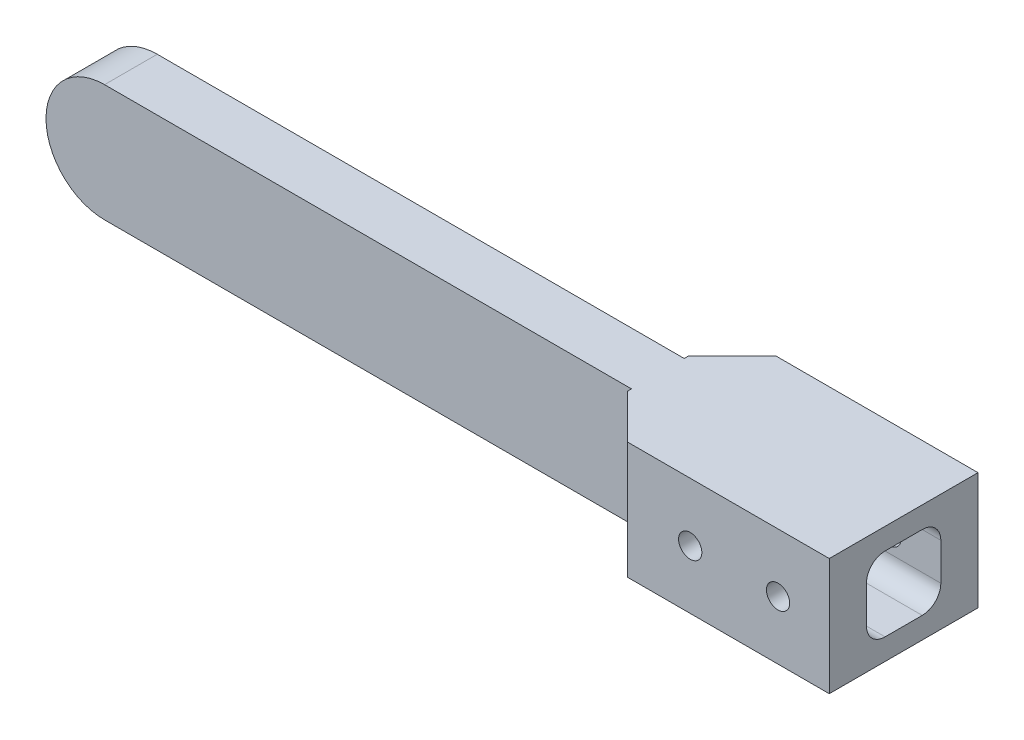
ISO-10303-21;
HEADER;
FILE_DESCRIPTION(('STEP AP214'),'2;1');
FILE_NAME('part.step','',(''),(''),'','','');
FILE_SCHEMA(('AUTOMOTIVE_DESIGN { 1 0 10303 214 1 1 1 1 }'));
ENDSEC;
DATA;
#1=APPLICATION_CONTEXT('core data for automotive mechanical design processes');
#2=APPLICATION_PROTOCOL_DEFINITION('international standard','automotive_design',2000,#1);
#3=PRODUCT_CONTEXT('',#1,'mechanical');
#4=PRODUCT('Part','Part','',(#3));
#5=PRODUCT_RELATED_PRODUCT_CATEGORY('part','',(#4));
#6=PRODUCT_DEFINITION_FORMATION('','',#4);
#7=PRODUCT_DEFINITION_CONTEXT('part definition',#1,'design');
#8=PRODUCT_DEFINITION('design','',#6,#7);
#9=PRODUCT_DEFINITION_SHAPE('','',#8);
#10=(LENGTH_UNIT() NAMED_UNIT(*) SI_UNIT(.MILLI.,.METRE.));
#11=(NAMED_UNIT(*) PLANE_ANGLE_UNIT() SI_UNIT($,.RADIAN.));
#12=(NAMED_UNIT(*) SI_UNIT($,.STERADIAN.) SOLID_ANGLE_UNIT());
#13=UNCERTAINTY_MEASURE_WITH_UNIT(LENGTH_MEASURE(1.E-05),#10,'distance_accuracy_value','');
#14=(GEOMETRIC_REPRESENTATION_CONTEXT(3) GLOBAL_UNCERTAINTY_ASSIGNED_CONTEXT((#13)) GLOBAL_UNIT_ASSIGNED_CONTEXT((#10,
#11,#12)) REPRESENTATION_CONTEXT('',''));
#15=CARTESIAN_POINT('',(0.,0.,0.));
#16=DIRECTION('',(0.,0.,1.));
#17=DIRECTION('',(1.,0.,0.));
#18=AXIS2_PLACEMENT_3D('',#15,#16,#17);
#19=CARTESIAN_POINT('',(20.,20.,0.));
#20=DIRECTION('',(0.,0.,1.));
#21=DIRECTION('',(1.,0.,0.));
#22=AXIS2_PLACEMENT_3D('',#19,#20,#21);
#23=CYLINDRICAL_SURFACE('',#22,20.);
#24=DIRECTION('',(0.,0.,1.));
#25=VECTOR('',#24,1.);
#26=CARTESIAN_POINT('',(20.,40.,0.));
#27=LINE('',#26,#25);
#28=CARTESIAN_POINT('',(20.,40.,0.));
#29=VERTEX_POINT('',#28);
#30=CARTESIAN_POINT('',(20.,40.,18.));
#31=VERTEX_POINT('',#30);
#32=EDGE_CURVE('E187',#29,#31,#27,.T.);
#33=ORIENTED_EDGE('',*,*,#32,.F.);
#34=CARTESIAN_POINT('',(20.,20.,0.));
#35=DIRECTION('',(0.,0.,1.));
#36=DIRECTION('',(1.,0.,0.));
#37=AXIS2_PLACEMENT_3D('',#34,#35,#36);
#38=CIRCLE('',#37,20.);
#39=CARTESIAN_POINT('',(20.,0.,0.));
#40=VERTEX_POINT('',#39);
#41=EDGE_CURVE('E198',#40,#29,#38,.F.);
#42=ORIENTED_EDGE('',*,*,#41,.F.);
#43=DIRECTION('',(0.,0.,-1.));
#44=VECTOR('',#43,1.);
#45=CARTESIAN_POINT('',(20.,0.,0.));
#46=LINE('',#45,#44);
#47=CARTESIAN_POINT('',(20.,0.,18.));
#48=VERTEX_POINT('',#47);
#49=EDGE_CURVE('E190',#48,#40,#46,.T.);
#50=ORIENTED_EDGE('',*,*,#49,.F.);
#51=CARTESIAN_POINT('',(20.,20.,18.));
#52=DIRECTION('',(0.,0.,-1.));
#53=DIRECTION('',(-1.,0.,0.));
#54=AXIS2_PLACEMENT_3D('',#51,#52,#53);
#55=CIRCLE('',#54,20.);
#56=EDGE_CURVE('E200',#31,#48,#55,.F.);
#57=ORIENTED_EDGE('',*,*,#56,.F.);
#58=EDGE_LOOP('',(#33,#42,#50,#57));
#59=FACE_BOUND('',#58,.T.);
#60=ADVANCED_FACE('F37',(#59),#23,.T.);
#61=CARTESIAN_POINT('',(215.,40.,-16.4));
#62=DIRECTION('',(0.,0.,1.));
#63=DIRECTION('',(1.,0.,0.));
#64=AXIS2_PLACEMENT_3D('',#61,#62,#63);
#65=PLANE('',#64);
#66=CARTESIAN_POINT('',(266.4431,20.,-16.4));
#67=DIRECTION('',(0.,0.,1.));
#68=DIRECTION('',(1.,0.,0.));
#69=AXIS2_PLACEMENT_3D('',#66,#67,#68);
#70=CIRCLE('',#69,3.96875000000005);
#71=CARTESIAN_POINT('',(270.41185,20.,-16.4));
#72=VERTEX_POINT('',#71);
#73=EDGE_CURVE('E207',#72,#72,#70,.T.);
#74=ORIENTED_EDGE('',*,*,#73,.T.);
#75=EDGE_LOOP('',(#74));
#76=FACE_BOUND('',#75,.T.);
#77=CARTESIAN_POINT('',(236.4431,20.,-16.4));
#78=DIRECTION('',(0.,0.,1.));
#79=DIRECTION('',(1.,0.,0.));
#80=AXIS2_PLACEMENT_3D('',#77,#78,#79);
#81=CIRCLE('',#80,3.96874999999999);
#82=CARTESIAN_POINT('',(240.41185,20.,-16.4));
#83=VERTEX_POINT('',#82);
#84=EDGE_CURVE('E555',#83,#83,#81,.T.);
#85=ORIENTED_EDGE('',*,*,#84,.T.);
#86=EDGE_LOOP('',(#85));
#87=FACE_BOUND('',#86,.T.);
#88=DIRECTION('',(-1.,0.,0.));
#89=VECTOR('',#88,1.);
#90=CARTESIAN_POINT('',(215.,0.,-16.4));
#91=LINE('',#90,#89);
#92=CARTESIAN_POINT('',(283.9431,0.,-16.4));
#93=VERTEX_POINT('',#92);
#94=CARTESIAN_POINT('',(215.,0.,-16.4));
#95=VERTEX_POINT('',#94);
#96=EDGE_CURVE('E186',#93,#95,#91,.T.);
#97=ORIENTED_EDGE('',*,*,#96,.T.);
#98=DIRECTION('',(0.,-1.,0.));
#99=VECTOR('',#98,1.);
#100=CARTESIAN_POINT('',(215.,40.,-16.4));
#101=LINE('',#100,#99);
#102=CARTESIAN_POINT('',(215.,40.,-16.4));
#103=VERTEX_POINT('',#102);
#104=EDGE_CURVE('E165',#103,#95,#101,.T.);
#105=ORIENTED_EDGE('',*,*,#104,.F.);
#106=DIRECTION('',(-1.,0.,0.));
#107=VECTOR('',#106,1.);
#108=CARTESIAN_POINT('',(215.,40.,-16.4));
#109=LINE('',#108,#107);
#110=CARTESIAN_POINT('',(283.9431,40.,-16.4));
#111=VERTEX_POINT('',#110);
#112=EDGE_CURVE('E172',#111,#103,#109,.T.);
#113=ORIENTED_EDGE('',*,*,#112,.F.);
#114=DIRECTION('',(0.,-1.,0.));
#115=VECTOR('',#114,1.);
#116=CARTESIAN_POINT('',(283.9431,40.,-16.4));
#117=LINE('',#116,#115);
#118=EDGE_CURVE('E294',#111,#93,#117,.T.);
#119=ORIENTED_EDGE('',*,*,#118,.T.);
#120=EDGE_LOOP('',(#97,#105,#113,#119));
#121=FACE_BOUND('',#120,.T.);
#122=ADVANCED_FACE('F184',(#76,#87,#121),#65,.F.);
#123=CARTESIAN_POINT('',(200.,40.,-1.39999999999999));
#124=DIRECTION('',(0.707106781186548,0.,0.707106781186547));
#125=DIRECTION('',(0.707106781186547,0.,-0.707106781186548));
#126=AXIS2_PLACEMENT_3D('',#123,#124,#125);
#127=PLANE('',#126);
#128=DIRECTION('',(-0.707106781186547,0.,0.707106781186548));
#129=VECTOR('',#128,1.);
#130=CARTESIAN_POINT('',(200.,0.,-1.39999999999999));
#131=LINE('',#130,#129);
#132=CARTESIAN_POINT('',(200.,0.,-1.39999999999999));
#133=VERTEX_POINT('',#132);
#134=EDGE_CURVE('E296',#95,#133,#131,.T.);
#135=ORIENTED_EDGE('',*,*,#134,.T.);
#136=DIRECTION('',(0.,-1.,0.));
#137=VECTOR('',#136,1.);
#138=CARTESIAN_POINT('',(200.,40.,-1.39999999999999));
#139=LINE('',#138,#137);
#140=CARTESIAN_POINT('',(200.,40.,-1.39999999999999));
#141=VERTEX_POINT('',#140);
#142=EDGE_CURVE('E168',#141,#133,#139,.T.);
#143=ORIENTED_EDGE('',*,*,#142,.F.);
#144=DIRECTION('',(-0.707106781186547,0.,0.707106781186548));
#145=VECTOR('',#144,1.);
#146=CARTESIAN_POINT('',(200.,40.,-1.39999999999999));
#147=LINE('',#146,#145);
#148=EDGE_CURVE('E161',#103,#141,#147,.T.);
#149=ORIENTED_EDGE('',*,*,#148,.F.);
#150=ORIENTED_EDGE('',*,*,#104,.T.);
#151=EDGE_LOOP('',(#135,#143,#149,#150));
#152=FACE_BOUND('',#151,.T.);
#153=ADVANCED_FACE('F163',(#152),#127,.F.);
#154=CARTESIAN_POINT('',(200.,40.,0.));
#155=DIRECTION('',(1.,0.,0.));
#156=DIRECTION('',(0.,0.,-1.));
#157=AXIS2_PLACEMENT_3D('',#154,#155,#156);
#158=PLANE('',#157);
#159=DIRECTION('',(0.,0.,1.));
#160=VECTOR('',#159,1.);
#161=CARTESIAN_POINT('',(200.,0.,0.));
#162=LINE('',#161,#160);
#163=CARTESIAN_POINT('',(200.,0.,0.));
#164=VERTEX_POINT('',#163);
#165=EDGE_CURVE('E298',#133,#164,#162,.T.);
#166=ORIENTED_EDGE('',*,*,#165,.T.);
#167=DIRECTION('',(0.,-1.,0.));
#168=VECTOR('',#167,1.);
#169=CARTESIAN_POINT('',(200.,40.,0.));
#170=LINE('',#169,#168);
#171=CARTESIAN_POINT('',(200.,40.,0.));
#172=VERTEX_POINT('',#171);
#173=EDGE_CURVE('E192',#172,#164,#170,.T.);
#174=ORIENTED_EDGE('',*,*,#173,.F.);
#175=DIRECTION('',(0.,0.,1.));
#176=VECTOR('',#175,1.);
#177=CARTESIAN_POINT('',(200.,40.,0.));
#178=LINE('',#177,#176);
#179=EDGE_CURVE('E171',#141,#172,#178,.T.);
#180=ORIENTED_EDGE('',*,*,#179,.F.);
#181=ORIENTED_EDGE('',*,*,#142,.T.);
#182=EDGE_LOOP('',(#166,#174,#180,#181));
#183=FACE_BOUND('',#182,.T.);
#184=ADVANCED_FACE('F340',(#183),#158,.F.);
#185=CARTESIAN_POINT('',(0.,40.,0.));
#186=DIRECTION('',(0.,0.,1.));
#187=DIRECTION('',(1.,0.,0.));
#188=AXIS2_PLACEMENT_3D('',#185,#186,#187);
#189=PLANE('',#188);
#190=DIRECTION('',(-1.,0.,0.));
#191=VECTOR('',#190,1.);
#192=CARTESIAN_POINT('',(0.,0.,0.));
#193=LINE('',#192,#191);
#194=EDGE_CURVE('E300',#164,#40,#193,.T.);
#195=ORIENTED_EDGE('',*,*,#194,.T.);
#196=ORIENTED_EDGE('',*,*,#41,.T.);
#197=DIRECTION('',(-1.,0.,0.));
#198=VECTOR('',#197,1.);
#199=CARTESIAN_POINT('',(0.,40.,0.));
#200=LINE('',#199,#198);
#201=EDGE_CURVE('E283',#172,#29,#200,.T.);
#202=ORIENTED_EDGE('',*,*,#201,.F.);
#203=ORIENTED_EDGE('',*,*,#173,.T.);
#204=EDGE_LOOP('',(#195,#196,#202,#203));
#205=FACE_BOUND('',#204,.T.);
#206=ADVANCED_FACE('F329',(#205),#189,.F.);
#207=CARTESIAN_POINT('',(200.,40.,18.));
#208=DIRECTION('',(0.,0.,-1.));
#209=DIRECTION('',(-1.,0.,0.));
#210=AXIS2_PLACEMENT_3D('',#207,#208,#209);
#211=PLANE('',#210);
#212=DIRECTION('',(1.,0.,0.));
#213=VECTOR('',#212,1.);
#214=CARTESIAN_POINT('',(200.,40.,18.));
#215=LINE('',#214,#213);
#216=CARTESIAN_POINT('',(200.,40.,18.));
#217=VERTEX_POINT('',#216);
#218=EDGE_CURVE('E285',#31,#217,#215,.T.);
#219=ORIENTED_EDGE('',*,*,#218,.F.);
#220=ORIENTED_EDGE('',*,*,#56,.T.);
#221=DIRECTION('',(1.,0.,0.));
#222=VECTOR('',#221,1.);
#223=CARTESIAN_POINT('',(200.,0.,18.));
#224=LINE('',#223,#222);
#225=CARTESIAN_POINT('',(200.,0.,18.));
#226=VERTEX_POINT('',#225);
#227=EDGE_CURVE('E303',#48,#226,#224,.T.);
#228=ORIENTED_EDGE('',*,*,#227,.T.);
#229=DIRECTION('',(0.,-1.,0.));
#230=VECTOR('',#229,1.);
#231=CARTESIAN_POINT('',(200.,40.,18.));
#232=LINE('',#231,#230);
#233=EDGE_CURVE('E322',#217,#226,#232,.T.);
#234=ORIENTED_EDGE('',*,*,#233,.F.);
#235=EDGE_LOOP('',(#219,#220,#228,#234));
#236=FACE_BOUND('',#235,.T.);
#237=ADVANCED_FACE('F347',(#236),#211,.F.);
#238=CARTESIAN_POINT('',(200.,40.,19.4));
#239=DIRECTION('',(1.,0.,0.));
#240=DIRECTION('',(0.,0.,-1.));
#241=AXIS2_PLACEMENT_3D('',#238,#239,#240);
#242=PLANE('',#241);
#243=DIRECTION('',(0.,0.,1.));
#244=VECTOR('',#243,1.);
#245=CARTESIAN_POINT('',(200.,0.,19.4));
#246=LINE('',#245,#244);
#247=CARTESIAN_POINT('',(200.,0.,19.4));
#248=VERTEX_POINT('',#247);
#249=EDGE_CURVE('E305',#226,#248,#246,.T.);
#250=ORIENTED_EDGE('',*,*,#249,.T.);
#251=DIRECTION('',(0.,-1.,0.));
#252=VECTOR('',#251,1.);
#253=CARTESIAN_POINT('',(200.,40.,19.4));
#254=LINE('',#253,#252);
#255=CARTESIAN_POINT('',(200.,40.,19.4));
#256=VERTEX_POINT('',#255);
#257=EDGE_CURVE('E319',#256,#248,#254,.T.);
#258=ORIENTED_EDGE('',*,*,#257,.F.);
#259=DIRECTION('',(0.,0.,1.));
#260=VECTOR('',#259,1.);
#261=CARTESIAN_POINT('',(200.,40.,19.4));
#262=LINE('',#261,#260);
#263=EDGE_CURVE('E287',#217,#256,#262,.T.);
#264=ORIENTED_EDGE('',*,*,#263,.F.);
#265=ORIENTED_EDGE('',*,*,#233,.T.);
#266=EDGE_LOOP('',(#250,#258,#264,#265));
#267=FACE_BOUND('',#266,.T.);
#268=ADVANCED_FACE('F417',(#267),#242,.F.);
#269=CARTESIAN_POINT('',(215.,40.,34.4));
#270=DIRECTION('',(0.707106781186548,0.,-0.707106781186547));
#271=DIRECTION('',(-0.707106781186547,0.,-0.707106781186548));
#272=AXIS2_PLACEMENT_3D('',#269,#270,#271);
#273=PLANE('',#272);
#274=DIRECTION('',(0.707106781186547,0.,0.707106781186548));
#275=VECTOR('',#274,1.);
#276=CARTESIAN_POINT('',(215.,0.,34.4));
#277=LINE('',#276,#275);
#278=CARTESIAN_POINT('',(215.,0.,34.4));
#279=VERTEX_POINT('',#278);
#280=EDGE_CURVE('E307',#248,#279,#277,.T.);
#281=ORIENTED_EDGE('',*,*,#280,.T.);
#282=DIRECTION('',(0.,-1.,0.));
#283=VECTOR('',#282,1.);
#284=CARTESIAN_POINT('',(215.,40.,34.4));
#285=LINE('',#284,#283);
#286=CARTESIAN_POINT('',(215.,40.,34.4));
#287=VERTEX_POINT('',#286);
#288=EDGE_CURVE('E316',#287,#279,#285,.T.);
#289=ORIENTED_EDGE('',*,*,#288,.F.);
#290=DIRECTION('',(0.707106781186547,0.,0.707106781186548));
#291=VECTOR('',#290,1.);
#292=CARTESIAN_POINT('',(215.,40.,34.4));
#293=LINE('',#292,#291);
#294=EDGE_CURVE('E289',#256,#287,#293,.T.);
#295=ORIENTED_EDGE('',*,*,#294,.F.);
#296=ORIENTED_EDGE('',*,*,#257,.T.);
#297=EDGE_LOOP('',(#281,#289,#295,#296));
#298=FACE_BOUND('',#297,.T.);
#299=ADVANCED_FACE('F413',(#298),#273,.F.);
#300=CARTESIAN_POINT('',(283.9431,40.,34.4));
#301=DIRECTION('',(0.,0.,-1.));
#302=DIRECTION('',(-1.,0.,0.));
#303=AXIS2_PLACEMENT_3D('',#300,#301,#302);
#304=PLANE('',#303);
#305=CARTESIAN_POINT('',(266.4431,20.,34.4000000000001));
#306=DIRECTION('',(0.,0.,1.));
#307=DIRECTION('',(1.,0.,0.));
#308=AXIS2_PLACEMENT_3D('',#305,#306,#307);
#309=CIRCLE('',#308,3.96875000000005);
#310=CARTESIAN_POINT('',(270.41185,20.,34.4000000000001));
#311=VERTEX_POINT('',#310);
#312=EDGE_CURVE('E559',#311,#311,#309,.T.);
#313=ORIENTED_EDGE('',*,*,#312,.F.);
#314=EDGE_LOOP('',(#313));
#315=FACE_BOUND('',#314,.T.);
#316=CARTESIAN_POINT('',(236.4431,20.,34.4000000000001));
#317=DIRECTION('',(0.,0.,1.));
#318=DIRECTION('',(1.,0.,0.));
#319=AXIS2_PLACEMENT_3D('',#316,#317,#318);
#320=CIRCLE('',#319,3.96874999999999);
#321=CARTESIAN_POINT('',(240.41185,20.,34.4000000000001));
#322=VERTEX_POINT('',#321);
#323=EDGE_CURVE('E560',#322,#322,#320,.T.);
#324=ORIENTED_EDGE('',*,*,#323,.F.);
#325=EDGE_LOOP('',(#324));
#326=FACE_BOUND('',#325,.T.);
#327=DIRECTION('',(1.,0.,0.));
#328=VECTOR('',#327,1.);
#329=CARTESIAN_POINT('',(283.9431,0.,34.4));
#330=LINE('',#329,#328);
#331=CARTESIAN_POINT('',(283.9431,0.,34.4));
#332=VERTEX_POINT('',#331);
#333=EDGE_CURVE('E309',#279,#332,#330,.T.);
#334=ORIENTED_EDGE('',*,*,#333,.T.);
#335=DIRECTION('',(0.,-1.,0.));
#336=VECTOR('',#335,1.);
#337=CARTESIAN_POINT('',(283.9431,40.,34.4));
#338=LINE('',#337,#336);
#339=CARTESIAN_POINT('',(283.9431,40.,34.4));
#340=VERTEX_POINT('',#339);
#341=EDGE_CURVE('E313',#340,#332,#338,.T.);
#342=ORIENTED_EDGE('',*,*,#341,.F.);
#343=DIRECTION('',(1.,0.,0.));
#344=VECTOR('',#343,1.);
#345=CARTESIAN_POINT('',(283.9431,40.,34.4));
#346=LINE('',#345,#344);
#347=EDGE_CURVE('E291',#287,#340,#346,.T.);
#348=ORIENTED_EDGE('',*,*,#347,.F.);
#349=ORIENTED_EDGE('',*,*,#288,.T.);
#350=EDGE_LOOP('',(#334,#342,#348,#349));
#351=FACE_BOUND('',#350,.T.);
#352=ADVANCED_FACE('F410',(#315,#326,#351),#304,.F.);
#353=CARTESIAN_POINT('',(283.9431,40.,-16.4));
#354=DIRECTION('',(-1.,0.,0.));
#355=DIRECTION('',(0.,0.,1.));
#356=AXIS2_PLACEMENT_3D('',#353,#354,#355);
#357=PLANE('',#356);
#358=DIRECTION('',(0.,0.,-1.));
#359=VECTOR('',#358,1.);
#360=CARTESIAN_POINT('',(283.9431,7.3,21.7));
#361=LINE('',#360,#359);
#362=CARTESIAN_POINT('',(283.9431,7.3,15.35));
#363=VERTEX_POINT('',#362);
#364=CARTESIAN_POINT('',(283.9431,7.3,2.65));
#365=VERTEX_POINT('',#364);
#366=EDGE_CURVE('E246',#363,#365,#361,.T.);
#367=ORIENTED_EDGE('',*,*,#366,.F.);
#368=CARTESIAN_POINT('',(283.9431,13.65,15.35));
#369=DIRECTION('',(-1.,0.,0.));
#370=DIRECTION('',(0.,0.,1.));
#371=AXIS2_PLACEMENT_3D('',#368,#369,#370);
#372=CIRCLE('',#371,6.35);
#373=CARTESIAN_POINT('',(283.9431,13.65,21.7));
#374=VERTEX_POINT('',#373);
#375=EDGE_CURVE('E45',#363,#374,#372,.T.);
#376=ORIENTED_EDGE('',*,*,#375,.T.);
#377=DIRECTION('',(0.,-1.,0.));
#378=VECTOR('',#377,1.);
#379=CARTESIAN_POINT('',(283.9431,32.7,21.7));
#380=LINE('',#379,#378);
#381=CARTESIAN_POINT('',(283.9431,26.35,21.7));
#382=VERTEX_POINT('',#381);
#383=EDGE_CURVE('E245',#382,#374,#380,.T.);
#384=ORIENTED_EDGE('',*,*,#383,.F.);
#385=CARTESIAN_POINT('',(283.9431,26.35,15.35));
#386=DIRECTION('',(-1.,0.,0.));
#387=DIRECTION('',(0.,0.,1.));
#388=AXIS2_PLACEMENT_3D('',#385,#386,#387);
#389=CIRCLE('',#388,6.35);
#390=CARTESIAN_POINT('',(283.9431,32.7,15.35));
#391=VERTEX_POINT('',#390);
#392=EDGE_CURVE('E240',#382,#391,#389,.T.);
#393=ORIENTED_EDGE('',*,*,#392,.T.);
#394=DIRECTION('',(0.,0.,1.));
#395=VECTOR('',#394,1.);
#396=CARTESIAN_POINT('',(283.9431,32.7,21.7));
#397=LINE('',#396,#395);
#398=CARTESIAN_POINT('',(283.9431,32.7,2.65));
#399=VERTEX_POINT('',#398);
#400=EDGE_CURVE('E270',#399,#391,#397,.T.);
#401=ORIENTED_EDGE('',*,*,#400,.F.);
#402=CARTESIAN_POINT('',(283.9431,26.35,2.65));
#403=DIRECTION('',(-1.,0.,0.));
#404=DIRECTION('',(0.,0.,1.));
#405=AXIS2_PLACEMENT_3D('',#402,#403,#404);
#406=CIRCLE('',#405,6.35);
#407=CARTESIAN_POINT('',(283.9431,26.35,-3.7));
#408=VERTEX_POINT('',#407);
#409=EDGE_CURVE('E238',#399,#408,#406,.T.);
#410=ORIENTED_EDGE('',*,*,#409,.T.);
#411=DIRECTION('',(0.,1.,0.));
#412=VECTOR('',#411,1.);
#413=CARTESIAN_POINT('',(283.9431,32.7,-3.7));
#414=LINE('',#413,#412);
#415=CARTESIAN_POINT('',(283.9431,13.65,-3.7));
#416=VERTEX_POINT('',#415);
#417=EDGE_CURVE('E277',#416,#408,#414,.T.);
#418=ORIENTED_EDGE('',*,*,#417,.F.);
#419=CARTESIAN_POINT('',(283.9431,13.65,2.65));
#420=DIRECTION('',(-1.,0.,0.));
#421=DIRECTION('',(0.,0.,1.));
#422=AXIS2_PLACEMENT_3D('',#419,#420,#421);
#423=CIRCLE('',#422,6.35);
#424=EDGE_CURVE('E11',#416,#365,#423,.T.);
#425=ORIENTED_EDGE('',*,*,#424,.T.);
#426=EDGE_LOOP('',(#367,#376,#384,#393,#401,#410,#418,#425));
#427=FACE_BOUND('',#426,.T.);
#428=DIRECTION('',(0.,0.,-1.));
#429=VECTOR('',#428,1.);
#430=CARTESIAN_POINT('',(283.9431,0.,-16.4));
#431=LINE('',#430,#429);
#432=EDGE_CURVE('E182',#332,#93,#431,.T.);
#433=ORIENTED_EDGE('',*,*,#432,.T.);
#434=ORIENTED_EDGE('',*,*,#118,.F.);
#435=DIRECTION('',(0.,0.,-1.));
#436=VECTOR('',#435,1.);
#437=CARTESIAN_POINT('',(283.9431,40.,-16.4));
#438=LINE('',#437,#436);
#439=EDGE_CURVE('E178',#340,#111,#438,.T.);
#440=ORIENTED_EDGE('',*,*,#439,.F.);
#441=ORIENTED_EDGE('',*,*,#341,.T.);
#442=EDGE_LOOP('',(#433,#434,#440,#441));
#443=FACE_BOUND('',#442,.T.);
#444=ADVANCED_FACE('F243',(#427,#443),#357,.F.);
#445=CARTESIAN_POINT('',(0.,40.,0.));
#446=DIRECTION('',(0.,-1.,0.));
#447=DIRECTION('',(0.,0.,-1.));
#448=AXIS2_PLACEMENT_3D('',#445,#446,#447);
#449=PLANE('',#448);
#450=ORIENTED_EDGE('',*,*,#201,.T.);
#451=ORIENTED_EDGE('',*,*,#32,.T.);
#452=ORIENTED_EDGE('',*,*,#218,.T.);
#453=ORIENTED_EDGE('',*,*,#263,.T.);
#454=ORIENTED_EDGE('',*,*,#294,.T.);
#455=ORIENTED_EDGE('',*,*,#347,.T.);
#456=ORIENTED_EDGE('',*,*,#439,.T.);
#457=ORIENTED_EDGE('',*,*,#112,.T.);
#458=ORIENTED_EDGE('',*,*,#148,.T.);
#459=ORIENTED_EDGE('',*,*,#179,.T.);
#460=EDGE_LOOP('',(#450,#451,#452,#453,#454,#455,#456,#457,#458,#459));
#461=FACE_BOUND('',#460,.T.);
#462=ADVANCED_FACE('F176',(#461),#449,.F.);
#463=CARTESIAN_POINT('',(0.,0.,0.));
#464=DIRECTION('',(0.,-1.,0.));
#465=DIRECTION('',(0.,0.,-1.));
#466=AXIS2_PLACEMENT_3D('',#463,#464,#465);
#467=PLANE('',#466);
#468=ORIENTED_EDGE('',*,*,#227,.F.);
#469=ORIENTED_EDGE('',*,*,#49,.T.);
#470=ORIENTED_EDGE('',*,*,#194,.F.);
#471=ORIENTED_EDGE('',*,*,#165,.F.);
#472=ORIENTED_EDGE('',*,*,#134,.F.);
#473=ORIENTED_EDGE('',*,*,#96,.F.);
#474=ORIENTED_EDGE('',*,*,#432,.F.);
#475=ORIENTED_EDGE('',*,*,#333,.F.);
#476=ORIENTED_EDGE('',*,*,#280,.F.);
#477=ORIENTED_EDGE('',*,*,#249,.F.);
#478=EDGE_LOOP('',(#468,#469,#470,#471,#472,#473,#474,#475,#476,#477));
#479=FACE_BOUND('',#478,.T.);
#480=ADVANCED_FACE('F334',(#479),#467,.T.);
#481=CARTESIAN_POINT('',(218.9431,32.7,21.7));
#482=DIRECTION('',(0.,0.,1.));
#483=DIRECTION('',(1.,0.,0.));
#484=AXIS2_PLACEMENT_3D('',#481,#482,#483);
#485=PLANE('',#484);
#486=CARTESIAN_POINT('',(266.4431,20.,21.7));
#487=DIRECTION('',(0.,0.,1.));
#488=DIRECTION('',(1.,0.,0.));
#489=AXIS2_PLACEMENT_3D('',#486,#487,#488);
#490=CIRCLE('',#489,3.96875000000005);
#491=CARTESIAN_POINT('',(270.41185,20.,21.7));
#492=VERTEX_POINT('',#491);
#493=EDGE_CURVE('E211',#492,#492,#490,.T.);
#494=ORIENTED_EDGE('',*,*,#493,.T.);
#495=EDGE_LOOP('',(#494));
#496=FACE_BOUND('',#495,.T.);
#497=CARTESIAN_POINT('',(236.4431,20.,21.7));
#498=DIRECTION('',(0.,0.,1.));
#499=DIRECTION('',(1.,0.,0.));
#500=AXIS2_PLACEMENT_3D('',#497,#498,#499);
#501=CIRCLE('',#500,3.96874999999999);
#502=CARTESIAN_POINT('',(240.41185,20.,21.7));
#503=VERTEX_POINT('',#502);
#504=EDGE_CURVE('E206',#503,#503,#501,.T.);
#505=ORIENTED_EDGE('',*,*,#504,.T.);
#506=EDGE_LOOP('',(#505));
#507=FACE_BOUND('',#506,.T.);
#508=DIRECTION('',(0.,-1.,0.));
#509=VECTOR('',#508,1.);
#510=CARTESIAN_POINT('',(218.9431,32.7,21.7));
#511=LINE('',#510,#509);
#512=CARTESIAN_POINT('',(218.9431,26.35,21.7));
#513=VERTEX_POINT('',#512);
#514=CARTESIAN_POINT('',(218.9431,13.65,21.7));
#515=VERTEX_POINT('',#514);
#516=EDGE_CURVE('E262',#513,#515,#511,.T.);
#517=ORIENTED_EDGE('',*,*,#516,.F.);
#518=DIRECTION('',(1.,0.,0.));
#519=VECTOR('',#518,1.);
#520=CARTESIAN_POINT('',(283.9431,26.35,21.7));
#521=LINE('',#520,#519);
#522=EDGE_CURVE('E231',#513,#382,#521,.T.);
#523=ORIENTED_EDGE('',*,*,#522,.T.);
#524=ORIENTED_EDGE('',*,*,#383,.T.);
#525=DIRECTION('',(1.,0.,0.));
#526=VECTOR('',#525,1.);
#527=CARTESIAN_POINT('',(218.9431,13.65,21.7));
#528=LINE('',#527,#526);
#529=EDGE_CURVE('E229',#374,#515,#528,.F.);
#530=ORIENTED_EDGE('',*,*,#529,.T.);
#531=EDGE_LOOP('',(#517,#523,#524,#530));
#532=FACE_BOUND('',#531,.T.);
#533=ADVANCED_FACE('F249',(#496,#507,#532),#485,.F.);
#534=CARTESIAN_POINT('',(218.9431,32.7,21.7));
#535=DIRECTION('',(0.,1.,0.));
#536=DIRECTION('',(0.,0.,1.));
#537=AXIS2_PLACEMENT_3D('',#534,#535,#536);
#538=PLANE('',#537);
#539=DIRECTION('',(0.,0.,1.));
#540=VECTOR('',#539,1.);
#541=CARTESIAN_POINT('',(218.9431,32.7,21.7));
#542=LINE('',#541,#540);
#543=CARTESIAN_POINT('',(218.9431,32.7,2.65));
#544=VERTEX_POINT('',#543);
#545=CARTESIAN_POINT('',(218.9431,32.7,15.35));
#546=VERTEX_POINT('',#545);
#547=EDGE_CURVE('E268',#544,#546,#542,.T.);
#548=ORIENTED_EDGE('',*,*,#547,.F.);
#549=DIRECTION('',(1.,0.,0.));
#550=VECTOR('',#549,1.);
#551=CARTESIAN_POINT('',(283.9431,32.7,2.65));
#552=LINE('',#551,#550);
#553=EDGE_CURVE('E213',#544,#399,#552,.T.);
#554=ORIENTED_EDGE('',*,*,#553,.T.);
#555=ORIENTED_EDGE('',*,*,#400,.T.);
#556=DIRECTION('',(1.,0.,0.));
#557=VECTOR('',#556,1.);
#558=CARTESIAN_POINT('',(218.9431,32.7,15.35));
#559=LINE('',#558,#557);
#560=EDGE_CURVE('E202',#391,#546,#559,.F.);
#561=ORIENTED_EDGE('',*,*,#560,.T.);
#562=EDGE_LOOP('',(#548,#554,#555,#561));
#563=FACE_BOUND('',#562,.T.);
#564=ADVANCED_FACE('F386',(#563),#538,.F.);
#565=CARTESIAN_POINT('',(218.9431,32.7,-3.7));
#566=DIRECTION('',(0.,0.,-1.));
#567=DIRECTION('',(-1.,0.,0.));
#568=AXIS2_PLACEMENT_3D('',#565,#566,#567);
#569=PLANE('',#568);
#570=CARTESIAN_POINT('',(266.4431,20.,-3.7));
#571=DIRECTION('',(0.,0.,-1.));
#572=DIRECTION('',(-1.,0.,0.));
#573=AXIS2_PLACEMENT_3D('',#570,#571,#572);
#574=CIRCLE('',#573,3.96875000000005);
#575=CARTESIAN_POINT('',(270.41185,20.,-3.7));
#576=VERTEX_POINT('',#575);
#577=EDGE_CURVE('E208',#576,#576,#574,.T.);
#578=ORIENTED_EDGE('',*,*,#577,.T.);
#579=EDGE_LOOP('',(#578));
#580=FACE_BOUND('',#579,.T.);
#581=CARTESIAN_POINT('',(236.4431,20.,-3.7));
#582=DIRECTION('',(0.,0.,-1.));
#583=DIRECTION('',(-1.,0.,0.));
#584=AXIS2_PLACEMENT_3D('',#581,#582,#583);
#585=CIRCLE('',#584,3.96874999999999);
#586=CARTESIAN_POINT('',(240.41185,20.,-3.7));
#587=VERTEX_POINT('',#586);
#588=EDGE_CURVE('E203',#587,#587,#585,.T.);
#589=ORIENTED_EDGE('',*,*,#588,.T.);
#590=EDGE_LOOP('',(#589));
#591=FACE_BOUND('',#590,.T.);
#592=ORIENTED_EDGE('',*,*,#417,.T.);
#593=DIRECTION('',(1.,0.,0.));
#594=VECTOR('',#593,1.);
#595=CARTESIAN_POINT('',(218.9431,26.35,-3.7));
#596=LINE('',#595,#594);
#597=CARTESIAN_POINT('',(218.9431,26.35,-3.7));
#598=VERTEX_POINT('',#597);
#599=EDGE_CURVE('E219',#408,#598,#596,.F.);
#600=ORIENTED_EDGE('',*,*,#599,.T.);
#601=DIRECTION('',(0.,1.,0.));
#602=VECTOR('',#601,1.);
#603=CARTESIAN_POINT('',(218.9431,32.7,-3.7));
#604=LINE('',#603,#602);
#605=CARTESIAN_POINT('',(218.9431,13.65,-3.7));
#606=VERTEX_POINT('',#605);
#607=EDGE_CURVE('E266',#606,#598,#604,.T.);
#608=ORIENTED_EDGE('',*,*,#607,.F.);
#609=DIRECTION('',(1.,0.,0.));
#610=VECTOR('',#609,1.);
#611=CARTESIAN_POINT('',(283.9431,13.65,-3.7));
#612=LINE('',#611,#610);
#613=EDGE_CURVE('E216',#606,#416,#612,.T.);
#614=ORIENTED_EDGE('',*,*,#613,.T.);
#615=EDGE_LOOP('',(#592,#600,#608,#614));
#616=FACE_BOUND('',#615,.T.);
#617=ADVANCED_FACE('F380',(#580,#591,#616),#569,.F.);
#618=CARTESIAN_POINT('',(218.9431,7.3,21.7));
#619=DIRECTION('',(0.,-1.,0.));
#620=DIRECTION('',(0.,0.,-1.));
#621=AXIS2_PLACEMENT_3D('',#618,#619,#620);
#622=PLANE('',#621);
#623=DIRECTION('',(0.,0.,-1.));
#624=VECTOR('',#623,1.);
#625=CARTESIAN_POINT('',(218.9431,7.3,21.7));
#626=LINE('',#625,#624);
#627=CARTESIAN_POINT('',(218.9431,7.3,15.35));
#628=VERTEX_POINT('',#627);
#629=CARTESIAN_POINT('',(218.9431,7.3,2.65));
#630=VERTEX_POINT('',#629);
#631=EDGE_CURVE('E260',#628,#630,#626,.T.);
#632=ORIENTED_EDGE('',*,*,#631,.F.);
#633=DIRECTION('',(1.,0.,0.));
#634=VECTOR('',#633,1.);
#635=CARTESIAN_POINT('',(283.9431,7.3,15.35));
#636=LINE('',#635,#634);
#637=EDGE_CURVE('E236',#628,#363,#636,.T.);
#638=ORIENTED_EDGE('',*,*,#637,.T.);
#639=ORIENTED_EDGE('',*,*,#366,.T.);
#640=DIRECTION('',(1.,0.,0.));
#641=VECTOR('',#640,1.);
#642=CARTESIAN_POINT('',(218.9431,7.3,2.65));
#643=LINE('',#642,#641);
#644=EDGE_CURVE('E234',#365,#630,#643,.F.);
#645=ORIENTED_EDGE('',*,*,#644,.T.);
#646=EDGE_LOOP('',(#632,#638,#639,#645));
#647=FACE_BOUND('',#646,.T.);
#648=ADVANCED_FACE('F264',(#647),#622,.F.);
#649=CARTESIAN_POINT('',(218.9431,0.,0.));
#650=DIRECTION('',(1.,0.,0.));
#651=DIRECTION('',(0.,0.,-1.));
#652=AXIS2_PLACEMENT_3D('',#649,#650,#651);
#653=PLANE('',#652);
#654=ORIENTED_EDGE('',*,*,#607,.T.);
#655=CARTESIAN_POINT('',(218.9431,26.35,2.65));
#656=DIRECTION('',(1.,0.,0.));
#657=DIRECTION('',(0.,0.,-1.));
#658=AXIS2_PLACEMENT_3D('',#655,#656,#657);
#659=CIRCLE('',#658,6.35);
#660=EDGE_CURVE('E227',#598,#544,#659,.T.);
#661=ORIENTED_EDGE('',*,*,#660,.T.);
#662=ORIENTED_EDGE('',*,*,#547,.T.);
#663=CARTESIAN_POINT('',(218.9431,26.35,15.35));
#664=DIRECTION('',(1.,0.,0.));
#665=DIRECTION('',(0.,0.,-1.));
#666=AXIS2_PLACEMENT_3D('',#663,#664,#665);
#667=CIRCLE('',#666,6.35);
#668=EDGE_CURVE('E225',#546,#513,#667,.T.);
#669=ORIENTED_EDGE('',*,*,#668,.T.);
#670=ORIENTED_EDGE('',*,*,#516,.T.);
#671=CARTESIAN_POINT('',(218.9431,13.65,15.35));
#672=DIRECTION('',(1.,0.,0.));
#673=DIRECTION('',(0.,0.,-1.));
#674=AXIS2_PLACEMENT_3D('',#671,#672,#673);
#675=CIRCLE('',#674,6.35);
#676=EDGE_CURVE('E223',#515,#628,#675,.T.);
#677=ORIENTED_EDGE('',*,*,#676,.T.);
#678=ORIENTED_EDGE('',*,*,#631,.T.);
#679=CARTESIAN_POINT('',(218.9431,13.65,2.65));
#680=DIRECTION('',(1.,0.,0.));
#681=DIRECTION('',(0.,0.,-1.));
#682=AXIS2_PLACEMENT_3D('',#679,#680,#681);
#683=CIRCLE('',#682,6.35);
#684=EDGE_CURVE('E221',#630,#606,#683,.T.);
#685=ORIENTED_EDGE('',*,*,#684,.T.);
#686=EDGE_LOOP('',(#654,#661,#662,#669,#670,#677,#678,#685));
#687=FACE_BOUND('',#686,.T.);
#688=ADVANCED_FACE('F259',(#687),#653,.T.);
#689=CARTESIAN_POINT('',(236.4431,20.,-16.4));
#690=DIRECTION('',(0.,0.,1.));
#691=DIRECTION('',(1.,0.,0.));
#692=AXIS2_PLACEMENT_3D('',#689,#690,#691);
#693=CYLINDRICAL_SURFACE('',#692,3.96874999999999);
#694=CARTESIAN_POINT('',(240.41185,20.,-16.4));
#695=CARTESIAN_POINT('',(240.41185,20.,-16.2677083333333));
#696=CARTESIAN_POINT('',(240.41185,20.,-16.1354166666667));
#697=CARTESIAN_POINT('',(240.41185,20.,-15.8708333333333));
#698=CARTESIAN_POINT('',(240.41185,20.,-15.7385416666667));
#699=CARTESIAN_POINT('',(240.41185,20.,-15.4739583333333));
#700=CARTESIAN_POINT('',(240.41185,20.,-15.3416666666667));
#701=CARTESIAN_POINT('',(240.41185,20.,-15.0770833333333));
#702=CARTESIAN_POINT('',(240.41185,20.,-14.9447916666667));
#703=CARTESIAN_POINT('',(240.41185,20.,-14.6802083333333));
#704=CARTESIAN_POINT('',(240.41185,20.,-14.5479166666667));
#705=CARTESIAN_POINT('',(240.41185,20.,-14.2833333333333));
#706=CARTESIAN_POINT('',(240.41185,20.,-14.1510416666667));
#707=CARTESIAN_POINT('',(240.41185,20.,-13.8864583333333));
#708=CARTESIAN_POINT('',(240.41185,20.,-13.7541666666667));
#709=CARTESIAN_POINT('',(240.41185,20.,-13.4895833333333));
#710=CARTESIAN_POINT('',(240.41185,20.,-13.3572916666667));
#711=CARTESIAN_POINT('',(240.41185,20.,-13.0927083333333));
#712=CARTESIAN_POINT('',(240.41185,20.,-12.9604166666667));
#713=CARTESIAN_POINT('',(240.41185,20.,-12.6958333333333));
#714=CARTESIAN_POINT('',(240.41185,20.,-12.5635416666667));
#715=CARTESIAN_POINT('',(240.41185,20.,-12.2989583333333));
#716=CARTESIAN_POINT('',(240.41185,20.,-12.1666666666667));
#717=CARTESIAN_POINT('',(240.41185,20.,-11.9020833333333));
#718=CARTESIAN_POINT('',(240.41185,20.,-11.7697916666667));
#719=CARTESIAN_POINT('',(240.41185,20.,-11.5052083333333));
#720=CARTESIAN_POINT('',(240.41185,20.,-11.3729166666667));
#721=CARTESIAN_POINT('',(240.41185,20.,-11.1083333333333));
#722=CARTESIAN_POINT('',(240.41185,20.,-10.9760416666667));
#723=CARTESIAN_POINT('',(240.41185,20.,-10.7114583333333));
#724=CARTESIAN_POINT('',(240.41185,20.,-10.5791666666667));
#725=CARTESIAN_POINT('',(240.41185,20.,-10.3145833333333));
#726=CARTESIAN_POINT('',(240.41185,20.,-10.1822916666667));
#727=CARTESIAN_POINT('',(240.41185,20.,-9.91770833333333));
#728=CARTESIAN_POINT('',(240.41185,20.,-9.78541666666666));
#729=CARTESIAN_POINT('',(240.41185,20.,-9.52083333333333));
#730=CARTESIAN_POINT('',(240.41185,20.,-9.38854166666666));
#731=CARTESIAN_POINT('',(240.41185,20.,-9.12395833333333));
#732=CARTESIAN_POINT('',(240.41185,20.,-8.99166666666666));
#733=CARTESIAN_POINT('',(240.41185,20.,-8.72708333333333));
#734=CARTESIAN_POINT('',(240.41185,20.,-8.59479166666666));
#735=CARTESIAN_POINT('',(240.41185,20.,-8.33020833333333));
#736=CARTESIAN_POINT('',(240.41185,20.,-8.19791666666666));
#737=CARTESIAN_POINT('',(240.41185,20.,-7.93333333333333));
#738=CARTESIAN_POINT('',(240.41185,20.,-7.80104166666666));
#739=CARTESIAN_POINT('',(240.41185,20.,-7.53645833333333));
#740=CARTESIAN_POINT('',(240.41185,20.,-7.40416666666666));
#741=CARTESIAN_POINT('',(240.41185,20.,-7.13958333333333));
#742=CARTESIAN_POINT('',(240.41185,20.,-7.00729166666666));
#743=CARTESIAN_POINT('',(240.41185,20.,-6.74270833333333));
#744=CARTESIAN_POINT('',(240.41185,20.,-6.61041666666666));
#745=CARTESIAN_POINT('',(240.41185,20.,-6.34583333333333));
#746=CARTESIAN_POINT('',(240.41185,20.,-6.21354166666666));
#747=CARTESIAN_POINT('',(240.41185,20.,-5.94895833333333));
#748=CARTESIAN_POINT('',(240.41185,20.,-5.81666666666666));
#749=CARTESIAN_POINT('',(240.41185,20.,-5.55208333333333));
#750=CARTESIAN_POINT('',(240.41185,20.,-5.41979166666666));
#751=CARTESIAN_POINT('',(240.41185,20.,-5.15520833333333));
#752=CARTESIAN_POINT('',(240.41185,20.,-5.02291666666666));
#753=CARTESIAN_POINT('',(240.41185,20.,-4.75833333333333));
#754=CARTESIAN_POINT('',(240.41185,20.,-4.62604166666666));
#755=CARTESIAN_POINT('',(240.41185,20.,-4.36145833333333));
#756=CARTESIAN_POINT('',(240.41185,20.,-4.22916666666666));
#757=CARTESIAN_POINT('',(240.41185,20.,-3.96458333333333));
#758=CARTESIAN_POINT('',(240.41185,20.,-3.83229166666666));
#759=CARTESIAN_POINT('',(240.41185,20.,-3.7));
#760=B_SPLINE_CURVE_WITH_KNOTS('',3,(#694,#695,#696,#697,#698,#699,#700,#701,#702,#703,#704,
#705,#706,#707,#708,#709,#710,#711,#712,#713,#714,#715,#716,#717,#718,#719,#720,#721,#722,#723,
#724,#725,#726,#727,#728,#729,#730,#731,#732,#733,#734,#735,#736,#737,#738,#739,#740,#741,#742,
#743,#744,#745,#746,#747,#748,#749,#750,#751,#752,#753,#754,#755,#756,#757,#758,#759),
.UNSPECIFIED.,.F.,.F.,(4,2,2,2,2,2,2,2,2,2,2,2,2,2,2,2,2,2,2,2,2,2,2,2,2,2,2,2,2,2,2,2,4),(0.,
0.396874999999998,0.793749999999998,1.190625,1.5875,1.984375,2.38125,2.778125,3.175,3.571875,
3.96875,4.365625,4.7625,5.159375,5.55625,5.953125,6.35,6.746875,7.14375,7.540625,
7.93749999999999,8.33437499999999,8.73124999999999,9.128125,9.525,9.92187499999999,10.31875,
10.715625,11.1125,11.509375,11.90625,12.303125,12.7),.UNSPECIFIED.);
#761=EDGE_CURVE('BSEAM496',#83,#587,#760,.T.);
#762=ORIENTED_EDGE('',*,*,#84,.F.);
#763=ORIENTED_EDGE('',*,*,#588,.F.);
#764=ORIENTED_EDGE('',*,*,#761,.T.);
#765=ORIENTED_EDGE('',*,*,#761,.F.);
#766=EDGE_LOOP('',(#762,#764,#763,#765));
#767=FACE_BOUND('',#766,.T.);
#768=ADVANCED_FACE('F496',(#767),#693,.F.);
#769=CARTESIAN_POINT('',(266.4431,20.,-16.4));
#770=DIRECTION('',(0.,0.,1.));
#771=DIRECTION('',(1.,0.,0.));
#772=AXIS2_PLACEMENT_3D('',#769,#770,#771);
#773=CYLINDRICAL_SURFACE('',#772,3.96875000000005);
#774=CARTESIAN_POINT('',(270.41185,20.,-16.4));
#775=CARTESIAN_POINT('',(270.41185,20.,-16.2677083333333));
#776=CARTESIAN_POINT('',(270.41185,20.,-16.1354166666667));
#777=CARTESIAN_POINT('',(270.41185,20.,-15.8708333333333));
#778=CARTESIAN_POINT('',(270.41185,20.,-15.7385416666667));
#779=CARTESIAN_POINT('',(270.41185,20.,-15.4739583333333));
#780=CARTESIAN_POINT('',(270.41185,20.,-15.3416666666667));
#781=CARTESIAN_POINT('',(270.41185,20.,-15.0770833333333));
#782=CARTESIAN_POINT('',(270.41185,20.,-14.9447916666667));
#783=CARTESIAN_POINT('',(270.41185,20.,-14.6802083333333));
#784=CARTESIAN_POINT('',(270.41185,20.,-14.5479166666667));
#785=CARTESIAN_POINT('',(270.41185,20.,-14.2833333333333));
#786=CARTESIAN_POINT('',(270.41185,20.,-14.1510416666667));
#787=CARTESIAN_POINT('',(270.41185,20.,-13.8864583333333));
#788=CARTESIAN_POINT('',(270.41185,20.,-13.7541666666667));
#789=CARTESIAN_POINT('',(270.41185,20.,-13.4895833333333));
#790=CARTESIAN_POINT('',(270.41185,20.,-13.3572916666667));
#791=CARTESIAN_POINT('',(270.41185,20.,-13.0927083333333));
#792=CARTESIAN_POINT('',(270.41185,20.,-12.9604166666667));
#793=CARTESIAN_POINT('',(270.41185,20.,-12.6958333333333));
#794=CARTESIAN_POINT('',(270.41185,20.,-12.5635416666667));
#795=CARTESIAN_POINT('',(270.41185,20.,-12.2989583333333));
#796=CARTESIAN_POINT('',(270.41185,20.,-12.1666666666667));
#797=CARTESIAN_POINT('',(270.41185,20.,-11.9020833333333));
#798=CARTESIAN_POINT('',(270.41185,20.,-11.7697916666667));
#799=CARTESIAN_POINT('',(270.41185,20.,-11.5052083333333));
#800=CARTESIAN_POINT('',(270.41185,20.,-11.3729166666667));
#801=CARTESIAN_POINT('',(270.41185,20.,-11.1083333333333));
#802=CARTESIAN_POINT('',(270.41185,20.,-10.9760416666667));
#803=CARTESIAN_POINT('',(270.41185,20.,-10.7114583333333));
#804=CARTESIAN_POINT('',(270.41185,20.,-10.5791666666667));
#805=CARTESIAN_POINT('',(270.41185,20.,-10.3145833333333));
#806=CARTESIAN_POINT('',(270.41185,20.,-10.1822916666667));
#807=CARTESIAN_POINT('',(270.41185,20.,-9.91770833333333));
#808=CARTESIAN_POINT('',(270.41185,20.,-9.78541666666666));
#809=CARTESIAN_POINT('',(270.41185,20.,-9.52083333333333));
#810=CARTESIAN_POINT('',(270.41185,20.,-9.38854166666666));
#811=CARTESIAN_POINT('',(270.41185,20.,-9.12395833333333));
#812=CARTESIAN_POINT('',(270.41185,20.,-8.99166666666666));
#813=CARTESIAN_POINT('',(270.41185,20.,-8.72708333333333));
#814=CARTESIAN_POINT('',(270.41185,20.,-8.59479166666666));
#815=CARTESIAN_POINT('',(270.41185,20.,-8.33020833333333));
#816=CARTESIAN_POINT('',(270.41185,20.,-8.19791666666666));
#817=CARTESIAN_POINT('',(270.41185,20.,-7.93333333333333));
#818=CARTESIAN_POINT('',(270.41185,20.,-7.80104166666666));
#819=CARTESIAN_POINT('',(270.41185,20.,-7.53645833333333));
#820=CARTESIAN_POINT('',(270.41185,20.,-7.40416666666666));
#821=CARTESIAN_POINT('',(270.41185,20.,-7.13958333333333));
#822=CARTESIAN_POINT('',(270.41185,20.,-7.00729166666666));
#823=CARTESIAN_POINT('',(270.41185,20.,-6.74270833333333));
#824=CARTESIAN_POINT('',(270.41185,20.,-6.61041666666666));
#825=CARTESIAN_POINT('',(270.41185,20.,-6.34583333333333));
#826=CARTESIAN_POINT('',(270.41185,20.,-6.21354166666666));
#827=CARTESIAN_POINT('',(270.41185,20.,-5.94895833333333));
#828=CARTESIAN_POINT('',(270.41185,20.,-5.81666666666666));
#829=CARTESIAN_POINT('',(270.41185,20.,-5.55208333333333));
#830=CARTESIAN_POINT('',(270.41185,20.,-5.41979166666666));
#831=CARTESIAN_POINT('',(270.41185,20.,-5.15520833333333));
#832=CARTESIAN_POINT('',(270.41185,20.,-5.02291666666666));
#833=CARTESIAN_POINT('',(270.41185,20.,-4.75833333333333));
#834=CARTESIAN_POINT('',(270.41185,20.,-4.62604166666666));
#835=CARTESIAN_POINT('',(270.41185,20.,-4.36145833333333));
#836=CARTESIAN_POINT('',(270.41185,20.,-4.22916666666666));
#837=CARTESIAN_POINT('',(270.41185,20.,-3.96458333333333));
#838=CARTESIAN_POINT('',(270.41185,20.,-3.83229166666666));
#839=CARTESIAN_POINT('',(270.41185,20.,-3.7));
#840=B_SPLINE_CURVE_WITH_KNOTS('',3,(#774,#775,#776,#777,#778,#779,#780,#781,#782,#783,#784,
#785,#786,#787,#788,#789,#790,#791,#792,#793,#794,#795,#796,#797,#798,#799,#800,#801,#802,#803,
#804,#805,#806,#807,#808,#809,#810,#811,#812,#813,#814,#815,#816,#817,#818,#819,#820,#821,#822,
#823,#824,#825,#826,#827,#828,#829,#830,#831,#832,#833,#834,#835,#836,#837,#838,#839),
.UNSPECIFIED.,.F.,.F.,(4,2,2,2,2,2,2,2,2,2,2,2,2,2,2,2,2,2,2,2,2,2,2,2,2,2,2,2,2,2,2,2,4),(0.,
0.396874999999998,0.793749999999998,1.190625,1.5875,1.984375,2.38125,2.778125,3.175,3.571875,
3.96875,4.365625,4.7625,5.159375,5.55625,5.953125,6.35,6.746875,7.14375,7.540625,
7.93749999999999,8.33437499999999,8.73124999999999,9.128125,9.525,9.92187499999999,10.31875,
10.715625,11.1125,11.509375,11.90625,12.303125,12.7),.UNSPECIFIED.);
#841=EDGE_CURVE('BSEAM528',#72,#576,#840,.T.);
#842=ORIENTED_EDGE('',*,*,#73,.F.);
#843=ORIENTED_EDGE('',*,*,#577,.F.);
#844=ORIENTED_EDGE('',*,*,#841,.T.);
#845=ORIENTED_EDGE('',*,*,#841,.F.);
#846=EDGE_LOOP('',(#842,#844,#843,#845));
#847=FACE_BOUND('',#846,.T.);
#848=ADVANCED_FACE('F528',(#847),#773,.F.);
#849=CARTESIAN_POINT('',(240.41185,20.,34.4000000000001));
#850=CARTESIAN_POINT('',(240.41185,20.,34.2677083333334));
#851=CARTESIAN_POINT('',(240.41185,20.,34.1354166666668));
#852=CARTESIAN_POINT('',(240.41185,20.,33.8708333333334));
#853=CARTESIAN_POINT('',(240.41185,20.,33.7385416666668));
#854=CARTESIAN_POINT('',(240.41185,20.,33.4739583333334));
#855=CARTESIAN_POINT('',(240.41185,20.,33.3416666666668));
#856=CARTESIAN_POINT('',(240.41185,20.,33.0770833333334));
#857=CARTESIAN_POINT('',(240.41185,20.,32.9447916666668));
#858=CARTESIAN_POINT('',(240.41185,20.,32.6802083333334));
#859=CARTESIAN_POINT('',(240.41185,20.,32.5479166666667));
#860=CARTESIAN_POINT('',(240.41185,20.,32.2833333333334));
#861=CARTESIAN_POINT('',(240.41185,20.,32.1510416666667));
#862=CARTESIAN_POINT('',(240.41185,20.,31.8864583333334));
#863=CARTESIAN_POINT('',(240.41185,20.,31.7541666666667));
#864=CARTESIAN_POINT('',(240.41185,20.,31.4895833333334));
#865=CARTESIAN_POINT('',(240.41185,20.,31.3572916666667));
#866=CARTESIAN_POINT('',(240.41185,20.,31.0927083333334));
#867=CARTESIAN_POINT('',(240.41185,20.,30.9604166666667));
#868=CARTESIAN_POINT('',(240.41185,20.,30.6958333333334));
#869=CARTESIAN_POINT('',(240.41185,20.,30.5635416666667));
#870=CARTESIAN_POINT('',(240.41185,20.,30.2989583333334));
#871=CARTESIAN_POINT('',(240.41185,20.,30.1666666666667));
#872=CARTESIAN_POINT('',(240.41185,20.,29.9020833333334));
#873=CARTESIAN_POINT('',(240.41185,20.,29.7697916666667));
#874=CARTESIAN_POINT('',(240.41185,20.,29.5052083333334));
#875=CARTESIAN_POINT('',(240.41185,20.,29.3729166666667));
#876=CARTESIAN_POINT('',(240.41185,20.,29.1083333333334));
#877=CARTESIAN_POINT('',(240.41185,20.,28.9760416666667));
#878=CARTESIAN_POINT('',(240.41185,20.,28.7114583333334));
#879=CARTESIAN_POINT('',(240.41185,20.,28.5791666666667));
#880=CARTESIAN_POINT('',(240.41185,20.,28.3145833333334));
#881=CARTESIAN_POINT('',(240.41185,20.,28.1822916666667));
#882=CARTESIAN_POINT('',(240.41185,20.,27.9177083333334));
#883=CARTESIAN_POINT('',(240.41185,20.,27.7854166666667));
#884=CARTESIAN_POINT('',(240.41185,20.,27.5208333333334));
#885=CARTESIAN_POINT('',(240.41185,20.,27.3885416666667));
#886=CARTESIAN_POINT('',(240.41185,20.,27.1239583333334));
#887=CARTESIAN_POINT('',(240.41185,20.,26.9916666666667));
#888=CARTESIAN_POINT('',(240.41185,20.,26.7270833333334));
#889=CARTESIAN_POINT('',(240.41185,20.,26.5947916666667));
#890=CARTESIAN_POINT('',(240.41185,20.,26.3302083333334));
#891=CARTESIAN_POINT('',(240.41185,20.,26.1979166666667));
#892=CARTESIAN_POINT('',(240.41185,20.,25.9333333333334));
#893=CARTESIAN_POINT('',(240.41185,20.,25.8010416666667));
#894=CARTESIAN_POINT('',(240.41185,20.,25.5364583333334));
#895=CARTESIAN_POINT('',(240.41185,20.,25.4041666666667));
#896=CARTESIAN_POINT('',(240.41185,20.,25.1395833333334));
#897=CARTESIAN_POINT('',(240.41185,20.,25.0072916666667));
#898=CARTESIAN_POINT('',(240.41185,20.,24.7427083333334));
#899=CARTESIAN_POINT('',(240.41185,20.,24.6104166666667));
#900=CARTESIAN_POINT('',(240.41185,20.,24.3458333333333));
#901=CARTESIAN_POINT('',(240.41185,20.,24.2135416666667));
#902=CARTESIAN_POINT('',(240.41185,20.,23.9489583333333));
#903=CARTESIAN_POINT('',(240.41185,20.,23.8166666666667));
#904=CARTESIAN_POINT('',(240.41185,20.,23.5520833333333));
#905=CARTESIAN_POINT('',(240.41185,20.,23.4197916666667));
#906=CARTESIAN_POINT('',(240.41185,20.,23.1552083333333));
#907=CARTESIAN_POINT('',(240.41185,20.,23.0229166666667));
#908=CARTESIAN_POINT('',(240.41185,20.,22.7583333333333));
#909=CARTESIAN_POINT('',(240.41185,20.,22.6260416666667));
#910=CARTESIAN_POINT('',(240.41185,20.,22.3614583333333));
#911=CARTESIAN_POINT('',(240.41185,20.,22.2291666666667));
#912=CARTESIAN_POINT('',(240.41185,20.,21.9645833333333));
#913=CARTESIAN_POINT('',(240.41185,20.,21.8322916666667));
#914=CARTESIAN_POINT('',(240.41185,20.,21.7));
#915=B_SPLINE_CURVE_WITH_KNOTS('',3,(#849,#850,#851,#852,#853,#854,#855,#856,#857,#858,#859,
#860,#861,#862,#863,#864,#865,#866,#867,#868,#869,#870,#871,#872,#873,#874,#875,#876,#877,#878,
#879,#880,#881,#882,#883,#884,#885,#886,#887,#888,#889,#890,#891,#892,#893,#894,#895,#896,#897,
#898,#899,#900,#901,#902,#903,#904,#905,#906,#907,#908,#909,#910,#911,#912,#913,#914),
.UNSPECIFIED.,.F.,.F.,(4,2,2,2,2,2,2,2,2,2,2,2,2,2,2,2,2,2,2,2,2,2,2,2,2,2,2,2,2,2,2,2,4),(0.,
0.396875000000005,0.79375000000001,1.19062500000001,1.58750000000001,1.98437500000002,
2.38125000000002,2.77812500000002,3.17500000000003,3.57187500000003,3.96875000000003,
4.36562500000003,4.76250000000004,5.15937500000004,5.55625000000004,5.95312500000005,
6.35000000000005,6.74687500000006,7.14375000000006,7.54062500000006,7.93750000000006,
8.33437500000007,8.73125000000007,9.12812500000007,9.52500000000007,9.92187500000008,
10.3187500000001,10.7156250000001,11.1125000000001,11.5093750000001,11.9062500000001,
12.3031250000001,12.7000000000001),.UNSPECIFIED.);
#916=EDGE_CURVE('BSEAM525',#322,#503,#915,.T.);
#917=ORIENTED_EDGE('',*,*,#323,.T.);
#918=ORIENTED_EDGE('',*,*,#504,.F.);
#919=ORIENTED_EDGE('',*,*,#916,.T.);
#920=ORIENTED_EDGE('',*,*,#916,.F.);
#921=EDGE_LOOP('',(#917,#919,#918,#920));
#922=FACE_BOUND('',#921,.T.);
#923=ADVANCED_FACE('F525',(#922),#693,.F.);
#924=CARTESIAN_POINT('',(270.41185,20.,34.4000000000001));
#925=CARTESIAN_POINT('',(270.41185,20.,34.2677083333334));
#926=CARTESIAN_POINT('',(270.41185,20.,34.1354166666668));
#927=CARTESIAN_POINT('',(270.41185,20.,33.8708333333334));
#928=CARTESIAN_POINT('',(270.41185,20.,33.7385416666668));
#929=CARTESIAN_POINT('',(270.41185,20.,33.4739583333334));
#930=CARTESIAN_POINT('',(270.41185,20.,33.3416666666668));
#931=CARTESIAN_POINT('',(270.41185,20.,33.0770833333334));
#932=CARTESIAN_POINT('',(270.41185,20.,32.9447916666668));
#933=CARTESIAN_POINT('',(270.41185,20.,32.6802083333334));
#934=CARTESIAN_POINT('',(270.41185,20.,32.5479166666667));
#935=CARTESIAN_POINT('',(270.41185,20.,32.2833333333334));
#936=CARTESIAN_POINT('',(270.41185,20.,32.1510416666667));
#937=CARTESIAN_POINT('',(270.41185,20.,31.8864583333334));
#938=CARTESIAN_POINT('',(270.41185,20.,31.7541666666667));
#939=CARTESIAN_POINT('',(270.41185,20.,31.4895833333334));
#940=CARTESIAN_POINT('',(270.41185,20.,31.3572916666667));
#941=CARTESIAN_POINT('',(270.41185,20.,31.0927083333334));
#942=CARTESIAN_POINT('',(270.41185,20.,30.9604166666667));
#943=CARTESIAN_POINT('',(270.41185,20.,30.6958333333334));
#944=CARTESIAN_POINT('',(270.41185,20.,30.5635416666667));
#945=CARTESIAN_POINT('',(270.41185,20.,30.2989583333334));
#946=CARTESIAN_POINT('',(270.41185,20.,30.1666666666667));
#947=CARTESIAN_POINT('',(270.41185,20.,29.9020833333334));
#948=CARTESIAN_POINT('',(270.41185,20.,29.7697916666667));
#949=CARTESIAN_POINT('',(270.41185,20.,29.5052083333334));
#950=CARTESIAN_POINT('',(270.41185,20.,29.3729166666667));
#951=CARTESIAN_POINT('',(270.41185,20.,29.1083333333334));
#952=CARTESIAN_POINT('',(270.41185,20.,28.9760416666667));
#953=CARTESIAN_POINT('',(270.41185,20.,28.7114583333334));
#954=CARTESIAN_POINT('',(270.41185,20.,28.5791666666667));
#955=CARTESIAN_POINT('',(270.41185,20.,28.3145833333334));
#956=CARTESIAN_POINT('',(270.41185,20.,28.1822916666667));
#957=CARTESIAN_POINT('',(270.41185,20.,27.9177083333334));
#958=CARTESIAN_POINT('',(270.41185,20.,27.7854166666667));
#959=CARTESIAN_POINT('',(270.41185,20.,27.5208333333334));
#960=CARTESIAN_POINT('',(270.41185,20.,27.3885416666667));
#961=CARTESIAN_POINT('',(270.41185,20.,27.1239583333334));
#962=CARTESIAN_POINT('',(270.41185,20.,26.9916666666667));
#963=CARTESIAN_POINT('',(270.41185,20.,26.7270833333334));
#964=CARTESIAN_POINT('',(270.41185,20.,26.5947916666667));
#965=CARTESIAN_POINT('',(270.41185,20.,26.3302083333334));
#966=CARTESIAN_POINT('',(270.41185,20.,26.1979166666667));
#967=CARTESIAN_POINT('',(270.41185,20.,25.9333333333334));
#968=CARTESIAN_POINT('',(270.41185,20.,25.8010416666667));
#969=CARTESIAN_POINT('',(270.41185,20.,25.5364583333334));
#970=CARTESIAN_POINT('',(270.41185,20.,25.4041666666667));
#971=CARTESIAN_POINT('',(270.41185,20.,25.1395833333334));
#972=CARTESIAN_POINT('',(270.41185,20.,25.0072916666667));
#973=CARTESIAN_POINT('',(270.41185,20.,24.7427083333334));
#974=CARTESIAN_POINT('',(270.41185,20.,24.6104166666667));
#975=CARTESIAN_POINT('',(270.41185,20.,24.3458333333333));
#976=CARTESIAN_POINT('',(270.41185,20.,24.2135416666667));
#977=CARTESIAN_POINT('',(270.41185,20.,23.9489583333333));
#978=CARTESIAN_POINT('',(270.41185,20.,23.8166666666667));
#979=CARTESIAN_POINT('',(270.41185,20.,23.5520833333333));
#980=CARTESIAN_POINT('',(270.41185,20.,23.4197916666667));
#981=CARTESIAN_POINT('',(270.41185,20.,23.1552083333333));
#982=CARTESIAN_POINT('',(270.41185,20.,23.0229166666667));
#983=CARTESIAN_POINT('',(270.41185,20.,22.7583333333333));
#984=CARTESIAN_POINT('',(270.41185,20.,22.6260416666667));
#985=CARTESIAN_POINT('',(270.41185,20.,22.3614583333333));
#986=CARTESIAN_POINT('',(270.41185,20.,22.2291666666667));
#987=CARTESIAN_POINT('',(270.41185,20.,21.9645833333333));
#988=CARTESIAN_POINT('',(270.41185,20.,21.8322916666667));
#989=CARTESIAN_POINT('',(270.41185,20.,21.7));
#990=B_SPLINE_CURVE_WITH_KNOTS('',3,(#924,#925,#926,#927,#928,#929,#930,#931,#932,#933,#934,
#935,#936,#937,#938,#939,#940,#941,#942,#943,#944,#945,#946,#947,#948,#949,#950,#951,#952,#953,
#954,#955,#956,#957,#958,#959,#960,#961,#962,#963,#964,#965,#966,#967,#968,#969,#970,#971,#972,
#973,#974,#975,#976,#977,#978,#979,#980,#981,#982,#983,#984,#985,#986,#987,#988,#989),
.UNSPECIFIED.,.F.,.F.,(4,2,2,2,2,2,2,2,2,2,2,2,2,2,2,2,2,2,2,2,2,2,2,2,2,2,2,2,2,2,2,2,4),(0.,
0.396875000000005,0.79375000000001,1.19062500000001,1.58750000000001,1.98437500000002,
2.38125000000002,2.77812500000002,3.17500000000003,3.57187500000003,3.96875000000003,
4.36562500000003,4.76250000000004,5.15937500000004,5.55625000000004,5.95312500000005,
6.35000000000005,6.74687500000006,7.14375000000006,7.54062500000006,7.93750000000006,
8.33437500000007,8.73125000000007,9.12812500000007,9.52500000000007,9.92187500000008,
10.3187500000001,10.7156250000001,11.1125000000001,11.5093750000001,11.9062500000001,
12.3031250000001,12.7000000000001),.UNSPECIFIED.);
#991=EDGE_CURVE('BSEAM365',#311,#492,#990,.T.);
#992=ORIENTED_EDGE('',*,*,#312,.T.);
#993=ORIENTED_EDGE('',*,*,#493,.F.);
#994=ORIENTED_EDGE('',*,*,#991,.T.);
#995=ORIENTED_EDGE('',*,*,#991,.F.);
#996=EDGE_LOOP('',(#992,#994,#993,#995));
#997=FACE_BOUND('',#996,.T.);
#998=ADVANCED_FACE('F365',(#997),#773,.F.);
#999=CARTESIAN_POINT('',(218.9431,26.35,2.65));
#1000=DIRECTION('',(-1.,0.,0.));
#1001=DIRECTION('',(0.,0.,1.));
#1002=AXIS2_PLACEMENT_3D('',#999,#1000,#1001);
#1003=CYLINDRICAL_SURFACE('',#1002,6.35);
#1004=ORIENTED_EDGE('',*,*,#660,.F.);
#1005=ORIENTED_EDGE('',*,*,#599,.F.);
#1006=ORIENTED_EDGE('',*,*,#409,.F.);
#1007=ORIENTED_EDGE('',*,*,#553,.F.);
#1008=EDGE_LOOP('',(#1004,#1005,#1006,#1007));
#1009=FACE_BOUND('',#1008,.T.);
#1010=ADVANCED_FACE('F361',(#1009),#1003,.F.);
#1011=CARTESIAN_POINT('',(218.9431,26.35,15.35));
#1012=DIRECTION('',(-1.,0.,0.));
#1013=DIRECTION('',(0.,0.,1.));
#1014=AXIS2_PLACEMENT_3D('',#1011,#1012,#1013);
#1015=CYLINDRICAL_SURFACE('',#1014,6.35);
#1016=ORIENTED_EDGE('',*,*,#668,.F.);
#1017=ORIENTED_EDGE('',*,*,#560,.F.);
#1018=ORIENTED_EDGE('',*,*,#392,.F.);
#1019=ORIENTED_EDGE('',*,*,#522,.F.);
#1020=EDGE_LOOP('',(#1016,#1017,#1018,#1019));
#1021=FACE_BOUND('',#1020,.T.);
#1022=ADVANCED_FACE('F364',(#1021),#1015,.F.);
#1023=CARTESIAN_POINT('',(218.9431,13.65,15.35));
#1024=DIRECTION('',(-1.,0.,0.));
#1025=DIRECTION('',(0.,0.,1.));
#1026=AXIS2_PLACEMENT_3D('',#1023,#1024,#1025);
#1027=CYLINDRICAL_SURFACE('',#1026,6.35);
#1028=ORIENTED_EDGE('',*,*,#676,.F.);
#1029=ORIENTED_EDGE('',*,*,#529,.F.);
#1030=ORIENTED_EDGE('',*,*,#375,.F.);
#1031=ORIENTED_EDGE('',*,*,#637,.F.);
#1032=EDGE_LOOP('',(#1028,#1029,#1030,#1031));
#1033=FACE_BOUND('',#1032,.T.);
#1034=ADVANCED_FACE('F254',(#1033),#1027,.F.);
#1035=CARTESIAN_POINT('',(218.9431,13.65,2.65));
#1036=DIRECTION('',(-1.,0.,0.));
#1037=DIRECTION('',(0.,0.,1.));
#1038=AXIS2_PLACEMENT_3D('',#1035,#1036,#1037);
#1039=CYLINDRICAL_SURFACE('',#1038,6.35);
#1040=ORIENTED_EDGE('',*,*,#684,.F.);
#1041=ORIENTED_EDGE('',*,*,#644,.F.);
#1042=ORIENTED_EDGE('',*,*,#424,.F.);
#1043=ORIENTED_EDGE('',*,*,#613,.F.);
#1044=EDGE_LOOP('',(#1040,#1041,#1042,#1043));
#1045=FACE_BOUND('',#1044,.T.);
#1046=ADVANCED_FACE('F39',(#1045),#1039,.F.);
#1047=CLOSED_SHELL('',(#60,#122,#153,#184,#206,#237,#268,#299,#352,#444,#462,#480,#533,#564,
#617,#648,#688,#768,#848,#923,#998,#1010,#1022,#1034,#1046));
#1048=MANIFOLD_SOLID_BREP('B2',#1047);
#1049=ADVANCED_BREP_SHAPE_REPRESENTATION('',(#18,#1048),#14);
#1050=SHAPE_DEFINITION_REPRESENTATION(#9,#1049);
ENDSEC;
END-ISO-10303-21;
